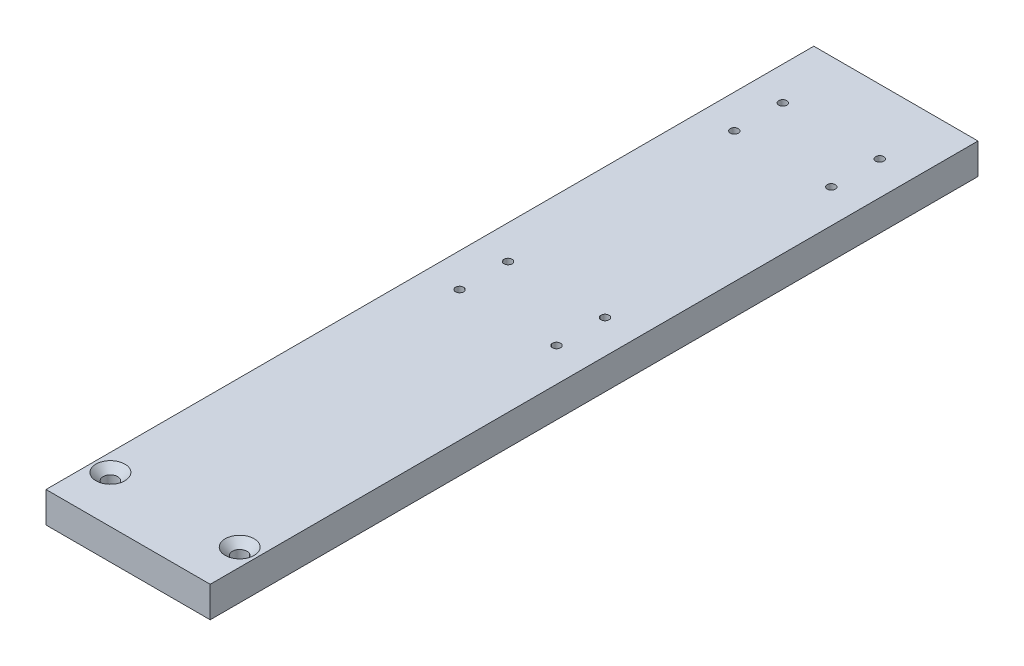
ISO-10303-21;
HEADER;
FILE_DESCRIPTION(('STEP AP214'),'2;1');
FILE_NAME('part.step','',(''),(''),'','','');
FILE_SCHEMA(('AUTOMOTIVE_DESIGN { 1 0 10303 214 1 1 1 1 }'));
ENDSEC;
DATA;
#1=APPLICATION_CONTEXT('core data for automotive mechanical design processes');
#2=APPLICATION_PROTOCOL_DEFINITION('international standard','automotive_design',2000,#1);
#3=PRODUCT_CONTEXT('',#1,'mechanical');
#4=PRODUCT('Part','Part','',(#3));
#5=PRODUCT_RELATED_PRODUCT_CATEGORY('part','',(#4));
#6=PRODUCT_DEFINITION_FORMATION('','',#4);
#7=PRODUCT_DEFINITION_CONTEXT('part definition',#1,'design');
#8=PRODUCT_DEFINITION('design','',#6,#7);
#9=PRODUCT_DEFINITION_SHAPE('','',#8);
#10=(LENGTH_UNIT() NAMED_UNIT(*) SI_UNIT(.MILLI.,.METRE.));
#11=(NAMED_UNIT(*) PLANE_ANGLE_UNIT() SI_UNIT($,.RADIAN.));
#12=(NAMED_UNIT(*) SI_UNIT($,.STERADIAN.) SOLID_ANGLE_UNIT());
#13=UNCERTAINTY_MEASURE_WITH_UNIT(LENGTH_MEASURE(1.E-05),#10,'distance_accuracy_value','');
#14=(GEOMETRIC_REPRESENTATION_CONTEXT(3) GLOBAL_UNCERTAINTY_ASSIGNED_CONTEXT((#13)) GLOBAL_UNIT_ASSIGNED_CONTEXT((#10,
#11,#12)) REPRESENTATION_CONTEXT('',''));
#15=CARTESIAN_POINT('',(0.,0.,0.));
#16=DIRECTION('',(0.,0.,1.));
#17=DIRECTION('',(1.,0.,0.));
#18=AXIS2_PLACEMENT_3D('',#15,#16,#17);
#19=CARTESIAN_POINT('',(-25.4,4.7625,118.775));
#20=DIRECTION('',(0.,-1.,0.));
#21=DIRECTION('',(0.,0.,-1.));
#22=AXIS2_PLACEMENT_3D('',#19,#20,#21);
#23=PLANE('',#22);
#24=CARTESIAN_POINT('',(-20.,4.7625,104.25));
#25=DIRECTION('',(0.,1.,0.));
#26=DIRECTION('',(0.,0.,1.));
#27=AXIS2_PLACEMENT_3D('',#24,#25,#26);
#28=CIRCLE('',#27,4.48);
#29=CARTESIAN_POINT('',(-20.,4.7625,108.73));
#30=VERTEX_POINT('',#29);
#31=EDGE_CURVE('E172',#30,#30,#28,.T.);
#32=ORIENTED_EDGE('',*,*,#31,.F.);
#33=EDGE_LOOP('',(#32));
#34=FACE_BOUND('',#33,.T.);
#35=CARTESIAN_POINT('',(20.,4.7625,104.25));
#36=DIRECTION('',(0.,1.,0.));
#37=DIRECTION('',(0.,0.,1.));
#38=AXIS2_PLACEMENT_3D('',#35,#36,#37);
#39=CIRCLE('',#38,4.48);
#40=CARTESIAN_POINT('',(20.,4.7625,108.73));
#41=VERTEX_POINT('',#40);
#42=EDGE_CURVE('E163',#41,#41,#39,.T.);
#43=ORIENTED_EDGE('',*,*,#42,.F.);
#44=EDGE_LOOP('',(#43));
#45=FACE_BOUND('',#44,.T.);
#46=CARTESIAN_POINT('',(-15.,4.7625,-98.775));
#47=DIRECTION('',(0.,1.,0.));
#48=DIRECTION('',(0.,0.,1.));
#49=AXIS2_PLACEMENT_3D('',#46,#47,#48);
#50=CIRCLE('',#49,1.25);
#51=CARTESIAN_POINT('',(-15.,4.7625,-97.525));
#52=VERTEX_POINT('',#51);
#53=EDGE_CURVE('E154',#52,#52,#50,.T.);
#54=ORIENTED_EDGE('',*,*,#53,.F.);
#55=EDGE_LOOP('',(#54));
#56=FACE_BOUND('',#55,.T.);
#57=CARTESIAN_POINT('',(15.,4.7625,-98.775));
#58=DIRECTION('',(0.,1.,0.));
#59=DIRECTION('',(0.,0.,1.));
#60=AXIS2_PLACEMENT_3D('',#57,#58,#59);
#61=CIRCLE('',#60,1.25);
#62=CARTESIAN_POINT('',(15.,4.7625,-97.525));
#63=VERTEX_POINT('',#62);
#64=EDGE_CURVE('E148',#63,#63,#61,.T.);
#65=ORIENTED_EDGE('',*,*,#64,.F.);
#66=EDGE_LOOP('',(#65));
#67=FACE_BOUND('',#66,.T.);
#68=CARTESIAN_POINT('',(-15.,4.7625,-83.775));
#69=DIRECTION('',(0.,1.,0.));
#70=DIRECTION('',(0.,0.,1.));
#71=AXIS2_PLACEMENT_3D('',#68,#69,#70);
#72=CIRCLE('',#71,1.25);
#73=CARTESIAN_POINT('',(-15.,4.7625,-82.525));
#74=VERTEX_POINT('',#73);
#75=EDGE_CURVE('E142',#74,#74,#72,.T.);
#76=ORIENTED_EDGE('',*,*,#75,.F.);
#77=EDGE_LOOP('',(#76));
#78=FACE_BOUND('',#77,.T.);
#79=CARTESIAN_POINT('',(15.,4.7625,-83.775));
#80=DIRECTION('',(0.,1.,0.));
#81=DIRECTION('',(0.,0.,1.));
#82=AXIS2_PLACEMENT_3D('',#79,#80,#81);
#83=CIRCLE('',#82,1.25);
#84=CARTESIAN_POINT('',(15.,4.7625,-82.525));
#85=VERTEX_POINT('',#84);
#86=EDGE_CURVE('E136',#85,#85,#83,.T.);
#87=ORIENTED_EDGE('',*,*,#86,.F.);
#88=EDGE_LOOP('',(#87));
#89=FACE_BOUND('',#88,.T.);
#90=CARTESIAN_POINT('',(15.,4.7625,-13.775));
#91=DIRECTION('',(0.,1.,0.));
#92=DIRECTION('',(0.,0.,1.));
#93=AXIS2_PLACEMENT_3D('',#90,#91,#92);
#94=CIRCLE('',#93,1.25);
#95=CARTESIAN_POINT('',(15.,4.7625,-12.525));
#96=VERTEX_POINT('',#95);
#97=EDGE_CURVE('E130',#96,#96,#94,.T.);
#98=ORIENTED_EDGE('',*,*,#97,.F.);
#99=EDGE_LOOP('',(#98));
#100=FACE_BOUND('',#99,.T.);
#101=CARTESIAN_POINT('',(-15.,4.7625,-13.775));
#102=DIRECTION('',(0.,1.,0.));
#103=DIRECTION('',(0.,0.,1.));
#104=AXIS2_PLACEMENT_3D('',#101,#102,#103);
#105=CIRCLE('',#104,1.25);
#106=CARTESIAN_POINT('',(-15.,4.7625,-12.525));
#107=VERTEX_POINT('',#106);
#108=EDGE_CURVE('E124',#107,#107,#105,.T.);
#109=ORIENTED_EDGE('',*,*,#108,.F.);
#110=EDGE_LOOP('',(#109));
#111=FACE_BOUND('',#110,.T.);
#112=CARTESIAN_POINT('',(-15.,4.7625,1.22499999999999));
#113=DIRECTION('',(0.,1.,0.));
#114=DIRECTION('',(0.,0.,1.));
#115=AXIS2_PLACEMENT_3D('',#112,#113,#114);
#116=CIRCLE('',#115,1.25);
#117=CARTESIAN_POINT('',(-15.,4.7625,2.47499999999999));
#118=VERTEX_POINT('',#117);
#119=EDGE_CURVE('E112',#118,#118,#116,.T.);
#120=ORIENTED_EDGE('',*,*,#119,.F.);
#121=EDGE_LOOP('',(#120));
#122=FACE_BOUND('',#121,.T.);
#123=DIRECTION('',(-1.,0.,0.));
#124=VECTOR('',#123,1.);
#125=CARTESIAN_POINT('',(-25.4,4.7625,-118.775));
#126=LINE('',#125,#124);
#127=CARTESIAN_POINT('',(25.4,4.7625,-118.775));
#128=VERTEX_POINT('',#127);
#129=CARTESIAN_POINT('',(-25.4,4.7625,-118.775));
#130=VERTEX_POINT('',#129);
#131=EDGE_CURVE('E88',#128,#130,#126,.T.);
#132=ORIENTED_EDGE('',*,*,#131,.T.);
#133=DIRECTION('',(0.,0.,-1.));
#134=VECTOR('',#133,1.);
#135=CARTESIAN_POINT('',(-25.4,4.7625,118.775));
#136=LINE('',#135,#134);
#137=CARTESIAN_POINT('',(-25.4,4.7625,118.775));
#138=VERTEX_POINT('',#137);
#139=EDGE_CURVE('E41',#138,#130,#136,.T.);
#140=ORIENTED_EDGE('',*,*,#139,.F.);
#141=DIRECTION('',(-1.,0.,0.));
#142=VECTOR('',#141,1.);
#143=CARTESIAN_POINT('',(-25.4,4.7625,118.775));
#144=LINE('',#143,#142);
#145=CARTESIAN_POINT('',(25.4,4.7625,118.775));
#146=VERTEX_POINT('',#145);
#147=EDGE_CURVE('E79',#146,#138,#144,.T.);
#148=ORIENTED_EDGE('',*,*,#147,.F.);
#149=DIRECTION('',(0.,0.,-1.));
#150=VECTOR('',#149,1.);
#151=CARTESIAN_POINT('',(25.4,4.7625,118.775));
#152=LINE('',#151,#150);
#153=EDGE_CURVE('E11',#146,#128,#152,.T.);
#154=ORIENTED_EDGE('',*,*,#153,.T.);
#155=EDGE_LOOP('',(#132,#140,#148,#154));
#156=FACE_BOUND('',#155,.T.);
#157=CARTESIAN_POINT('',(15.,4.7625,1.22499999999999));
#158=DIRECTION('',(0.,1.,0.));
#159=DIRECTION('',(0.,0.,1.));
#160=AXIS2_PLACEMENT_3D('',#157,#158,#159);
#161=CIRCLE('',#160,1.25);
#162=CARTESIAN_POINT('',(15.,4.7625,2.47499999999999));
#163=VERTEX_POINT('',#162);
#164=EDGE_CURVE('E118',#163,#163,#161,.T.);
#165=ORIENTED_EDGE('',*,*,#164,.F.);
#166=EDGE_LOOP('',(#165));
#167=FACE_BOUND('',#166,.T.);
#168=ADVANCED_FACE('F32',(#34,#45,#56,#67,#78,#89,#100,#111,#122,#156,#167),#23,.F.);
#169=CARTESIAN_POINT('',(25.4,-4.7625,118.775));
#170=DIRECTION('',(-1.,0.,0.));
#171=DIRECTION('',(0.,0.,1.));
#172=AXIS2_PLACEMENT_3D('',#169,#170,#171);
#173=PLANE('',#172);
#174=DIRECTION('',(0.,1.,0.));
#175=VECTOR('',#174,1.);
#176=CARTESIAN_POINT('',(25.4,-4.7625,-118.775));
#177=LINE('',#176,#175);
#178=CARTESIAN_POINT('',(25.4,-4.7625,-118.775));
#179=VERTEX_POINT('',#178);
#180=EDGE_CURVE('E96',#179,#128,#177,.T.);
#181=ORIENTED_EDGE('',*,*,#180,.T.);
#182=ORIENTED_EDGE('',*,*,#153,.F.);
#183=DIRECTION('',(0.,1.,0.));
#184=VECTOR('',#183,1.);
#185=CARTESIAN_POINT('',(25.4,-4.7625,118.775));
#186=LINE('',#185,#184);
#187=CARTESIAN_POINT('',(25.4,-4.7625,118.775));
#188=VERTEX_POINT('',#187);
#189=EDGE_CURVE('E84',#188,#146,#186,.T.);
#190=ORIENTED_EDGE('',*,*,#189,.F.);
#191=DIRECTION('',(0.,0.,-1.));
#192=VECTOR('',#191,1.);
#193=CARTESIAN_POINT('',(25.4,-4.7625,118.775));
#194=LINE('',#193,#192);
#195=EDGE_CURVE('E92',#188,#179,#194,.T.);
#196=ORIENTED_EDGE('',*,*,#195,.T.);
#197=EDGE_LOOP('',(#181,#182,#190,#196));
#198=FACE_BOUND('',#197,.T.);
#199=ADVANCED_FACE('F34',(#198),#173,.F.);
#200=CARTESIAN_POINT('',(-25.4,-4.7625,118.775));
#201=DIRECTION('',(1.,0.,0.));
#202=DIRECTION('',(0.,0.,-1.));
#203=AXIS2_PLACEMENT_3D('',#200,#201,#202);
#204=PLANE('',#203);
#205=DIRECTION('',(0.,-1.,0.));
#206=VECTOR('',#205,1.);
#207=CARTESIAN_POINT('',(-25.4,-4.7625,-118.775));
#208=LINE('',#207,#206);
#209=CARTESIAN_POINT('',(-25.4,-4.7625,-118.775));
#210=VERTEX_POINT('',#209);
#211=EDGE_CURVE('E66',#130,#210,#208,.T.);
#212=ORIENTED_EDGE('',*,*,#211,.T.);
#213=DIRECTION('',(0.,0.,-1.));
#214=VECTOR('',#213,1.);
#215=CARTESIAN_POINT('',(-25.4,-4.7625,118.775));
#216=LINE('',#215,#214);
#217=CARTESIAN_POINT('',(-25.4,-4.7625,118.775));
#218=VERTEX_POINT('',#217);
#219=EDGE_CURVE('E89',#218,#210,#216,.T.);
#220=ORIENTED_EDGE('',*,*,#219,.F.);
#221=DIRECTION('',(0.,-1.,0.));
#222=VECTOR('',#221,1.);
#223=CARTESIAN_POINT('',(-25.4,-4.7625,118.775));
#224=LINE('',#223,#222);
#225=EDGE_CURVE('E82',#138,#218,#224,.T.);
#226=ORIENTED_EDGE('',*,*,#225,.F.);
#227=ORIENTED_EDGE('',*,*,#139,.T.);
#228=EDGE_LOOP('',(#212,#220,#226,#227));
#229=FACE_BOUND('',#228,.T.);
#230=ADVANCED_FACE('F90',(#229),#204,.F.);
#231=CARTESIAN_POINT('',(-25.4,-4.7625,118.775));
#232=DIRECTION('',(0.,1.,0.));
#233=DIRECTION('',(0.,0.,1.));
#234=AXIS2_PLACEMENT_3D('',#231,#232,#233);
#235=PLANE('',#234);
#236=CARTESIAN_POINT('',(-20.,-4.7625,104.25));
#237=DIRECTION('',(0.,1.,0.));
#238=DIRECTION('',(0.,0.,1.));
#239=AXIS2_PLACEMENT_3D('',#236,#237,#238);
#240=CIRCLE('',#239,2.25);
#241=CARTESIAN_POINT('',(-20.,-4.7625,106.5));
#242=VERTEX_POINT('',#241);
#243=EDGE_CURVE('E166',#242,#242,#240,.T.);
#244=ORIENTED_EDGE('',*,*,#243,.T.);
#245=EDGE_LOOP('',(#244));
#246=FACE_BOUND('',#245,.T.);
#247=CARTESIAN_POINT('',(20.,-4.7625,104.25));
#248=DIRECTION('',(0.,1.,0.));
#249=DIRECTION('',(0.,0.,1.));
#250=AXIS2_PLACEMENT_3D('',#247,#248,#249);
#251=CIRCLE('',#250,2.25);
#252=CARTESIAN_POINT('',(20.,-4.7625,106.5));
#253=VERTEX_POINT('',#252);
#254=EDGE_CURVE('E157',#253,#253,#251,.T.);
#255=ORIENTED_EDGE('',*,*,#254,.T.);
#256=EDGE_LOOP('',(#255));
#257=FACE_BOUND('',#256,.T.);
#258=CARTESIAN_POINT('',(-15.,-4.7625,-98.775));
#259=DIRECTION('',(0.,1.,0.));
#260=DIRECTION('',(0.,0.,1.));
#261=AXIS2_PLACEMENT_3D('',#258,#259,#260);
#262=CIRCLE('',#261,1.25);
#263=CARTESIAN_POINT('',(-15.,-4.7625,-97.525));
#264=VERTEX_POINT('',#263);
#265=EDGE_CURVE('E151',#264,#264,#262,.T.);
#266=ORIENTED_EDGE('',*,*,#265,.T.);
#267=EDGE_LOOP('',(#266));
#268=FACE_BOUND('',#267,.T.);
#269=CARTESIAN_POINT('',(15.,-4.7625,-98.775));
#270=DIRECTION('',(0.,1.,0.));
#271=DIRECTION('',(0.,0.,1.));
#272=AXIS2_PLACEMENT_3D('',#269,#270,#271);
#273=CIRCLE('',#272,1.25);
#274=CARTESIAN_POINT('',(15.,-4.7625,-97.525));
#275=VERTEX_POINT('',#274);
#276=EDGE_CURVE('E145',#275,#275,#273,.T.);
#277=ORIENTED_EDGE('',*,*,#276,.T.);
#278=EDGE_LOOP('',(#277));
#279=FACE_BOUND('',#278,.T.);
#280=CARTESIAN_POINT('',(-15.,-4.7625,-83.775));
#281=DIRECTION('',(0.,1.,0.));
#282=DIRECTION('',(0.,0.,1.));
#283=AXIS2_PLACEMENT_3D('',#280,#281,#282);
#284=CIRCLE('',#283,1.25);
#285=CARTESIAN_POINT('',(-15.,-4.7625,-82.525));
#286=VERTEX_POINT('',#285);
#287=EDGE_CURVE('E139',#286,#286,#284,.T.);
#288=ORIENTED_EDGE('',*,*,#287,.T.);
#289=EDGE_LOOP('',(#288));
#290=FACE_BOUND('',#289,.T.);
#291=CARTESIAN_POINT('',(15.,-4.7625,-83.775));
#292=DIRECTION('',(0.,1.,0.));
#293=DIRECTION('',(0.,0.,1.));
#294=AXIS2_PLACEMENT_3D('',#291,#292,#293);
#295=CIRCLE('',#294,1.25);
#296=CARTESIAN_POINT('',(15.,-4.7625,-82.525));
#297=VERTEX_POINT('',#296);
#298=EDGE_CURVE('E133',#297,#297,#295,.T.);
#299=ORIENTED_EDGE('',*,*,#298,.T.);
#300=EDGE_LOOP('',(#299));
#301=FACE_BOUND('',#300,.T.);
#302=CARTESIAN_POINT('',(15.,-4.7625,-13.775));
#303=DIRECTION('',(0.,1.,0.));
#304=DIRECTION('',(0.,0.,1.));
#305=AXIS2_PLACEMENT_3D('',#302,#303,#304);
#306=CIRCLE('',#305,1.25);
#307=CARTESIAN_POINT('',(15.,-4.7625,-12.525));
#308=VERTEX_POINT('',#307);
#309=EDGE_CURVE('E127',#308,#308,#306,.T.);
#310=ORIENTED_EDGE('',*,*,#309,.T.);
#311=EDGE_LOOP('',(#310));
#312=FACE_BOUND('',#311,.T.);
#313=CARTESIAN_POINT('',(-15.,-4.7625,-13.775));
#314=DIRECTION('',(0.,1.,0.));
#315=DIRECTION('',(0.,0.,1.));
#316=AXIS2_PLACEMENT_3D('',#313,#314,#315);
#317=CIRCLE('',#316,1.25);
#318=CARTESIAN_POINT('',(-15.,-4.7625,-12.525));
#319=VERTEX_POINT('',#318);
#320=EDGE_CURVE('E121',#319,#319,#317,.T.);
#321=ORIENTED_EDGE('',*,*,#320,.T.);
#322=EDGE_LOOP('',(#321));
#323=FACE_BOUND('',#322,.T.);
#324=CARTESIAN_POINT('',(15.,-4.7625,1.22499999999999));
#325=DIRECTION('',(0.,1.,0.));
#326=DIRECTION('',(0.,0.,1.));
#327=AXIS2_PLACEMENT_3D('',#324,#325,#326);
#328=CIRCLE('',#327,1.25);
#329=CARTESIAN_POINT('',(15.,-4.7625,2.47499999999999));
#330=VERTEX_POINT('',#329);
#331=EDGE_CURVE('E115',#330,#330,#328,.T.);
#332=ORIENTED_EDGE('',*,*,#331,.T.);
#333=EDGE_LOOP('',(#332));
#334=FACE_BOUND('',#333,.T.);
#335=CARTESIAN_POINT('',(-15.,-4.7625,1.22499999999999));
#336=DIRECTION('',(0.,1.,0.));
#337=DIRECTION('',(0.,0.,1.));
#338=AXIS2_PLACEMENT_3D('',#335,#336,#337);
#339=CIRCLE('',#338,1.25);
#340=CARTESIAN_POINT('',(-15.,-4.7625,2.47499999999999));
#341=VERTEX_POINT('',#340);
#342=EDGE_CURVE('E99',#341,#341,#339,.T.);
#343=ORIENTED_EDGE('',*,*,#342,.T.);
#344=EDGE_LOOP('',(#343));
#345=FACE_BOUND('',#344,.T.);
#346=DIRECTION('',(1.,0.,0.));
#347=VECTOR('',#346,1.);
#348=CARTESIAN_POINT('',(-25.4,-4.7625,-118.775));
#349=LINE('',#348,#347);
#350=EDGE_CURVE('E72',#210,#179,#349,.T.);
#351=ORIENTED_EDGE('',*,*,#350,.T.);
#352=ORIENTED_EDGE('',*,*,#195,.F.);
#353=DIRECTION('',(1.,0.,0.));
#354=VECTOR('',#353,1.);
#355=CARTESIAN_POINT('',(-25.4,-4.7625,118.775));
#356=LINE('',#355,#354);
#357=EDGE_CURVE('E49',#218,#188,#356,.T.);
#358=ORIENTED_EDGE('',*,*,#357,.F.);
#359=ORIENTED_EDGE('',*,*,#219,.T.);
#360=EDGE_LOOP('',(#351,#352,#358,#359));
#361=FACE_BOUND('',#360,.T.);
#362=ADVANCED_FACE('F104',(#246,#257,#268,#279,#290,#301,#312,#323,#334,#345,#361),#235,.F.);
#363=CARTESIAN_POINT('',(0.,0.,118.775));
#364=DIRECTION('',(0.,0.,-1.));
#365=DIRECTION('',(-1.,0.,0.));
#366=AXIS2_PLACEMENT_3D('',#363,#364,#365);
#367=PLANE('',#366);
#368=ORIENTED_EDGE('',*,*,#189,.T.);
#369=ORIENTED_EDGE('',*,*,#147,.T.);
#370=ORIENTED_EDGE('',*,*,#225,.T.);
#371=ORIENTED_EDGE('',*,*,#357,.T.);
#372=EDGE_LOOP('',(#368,#369,#370,#371));
#373=FACE_BOUND('',#372,.T.);
#374=ADVANCED_FACE('F80',(#373),#367,.F.);
#375=CARTESIAN_POINT('',(0.,0.,-118.775));
#376=DIRECTION('',(0.,0.,-1.));
#377=DIRECTION('',(-1.,0.,0.));
#378=AXIS2_PLACEMENT_3D('',#375,#376,#377);
#379=PLANE('',#378);
#380=ORIENTED_EDGE('',*,*,#180,.F.);
#381=ORIENTED_EDGE('',*,*,#350,.F.);
#382=ORIENTED_EDGE('',*,*,#211,.F.);
#383=ORIENTED_EDGE('',*,*,#131,.F.);
#384=EDGE_LOOP('',(#380,#381,#382,#383));
#385=FACE_BOUND('',#384,.T.);
#386=ADVANCED_FACE('F107',(#385),#379,.T.);
#387=CARTESIAN_POINT('',(-15.,4.7625,1.22499999999999));
#388=DIRECTION('',(0.,1.,0.));
#389=DIRECTION('',(0.,0.,1.));
#390=AXIS2_PLACEMENT_3D('',#387,#388,#389);
#391=CYLINDRICAL_SURFACE('',#390,1.25);
#392=ORIENTED_EDGE('',*,*,#342,.F.);
#393=EDGE_LOOP('',(#392));
#394=FACE_BOUND('',#393,.T.);
#395=ORIENTED_EDGE('',*,*,#119,.T.);
#396=EDGE_LOOP('',(#395));
#397=FACE_BOUND('',#396,.T.);
#398=ADVANCED_FACE('F196',(#394,#397),#391,.F.);
#399=CARTESIAN_POINT('',(15.,4.7625,1.22499999999999));
#400=DIRECTION('',(0.,1.,0.));
#401=DIRECTION('',(0.,0.,1.));
#402=AXIS2_PLACEMENT_3D('',#399,#400,#401);
#403=CYLINDRICAL_SURFACE('',#402,1.25);
#404=ORIENTED_EDGE('',*,*,#331,.F.);
#405=EDGE_LOOP('',(#404));
#406=FACE_BOUND('',#405,.T.);
#407=ORIENTED_EDGE('',*,*,#164,.T.);
#408=EDGE_LOOP('',(#407));
#409=FACE_BOUND('',#408,.T.);
#410=ADVANCED_FACE('F198',(#406,#409),#403,.F.);
#411=CARTESIAN_POINT('',(-15.,4.7625,-13.775));
#412=DIRECTION('',(0.,1.,0.));
#413=DIRECTION('',(0.,0.,1.));
#414=AXIS2_PLACEMENT_3D('',#411,#412,#413);
#415=CYLINDRICAL_SURFACE('',#414,1.25);
#416=ORIENTED_EDGE('',*,*,#320,.F.);
#417=EDGE_LOOP('',(#416));
#418=FACE_BOUND('',#417,.T.);
#419=ORIENTED_EDGE('',*,*,#108,.T.);
#420=EDGE_LOOP('',(#419));
#421=FACE_BOUND('',#420,.T.);
#422=ADVANCED_FACE('F205',(#418,#421),#415,.F.);
#423=CARTESIAN_POINT('',(15.,4.7625,-13.775));
#424=DIRECTION('',(0.,1.,0.));
#425=DIRECTION('',(0.,0.,1.));
#426=AXIS2_PLACEMENT_3D('',#423,#424,#425);
#427=CYLINDRICAL_SURFACE('',#426,1.25);
#428=ORIENTED_EDGE('',*,*,#309,.F.);
#429=EDGE_LOOP('',(#428));
#430=FACE_BOUND('',#429,.T.);
#431=ORIENTED_EDGE('',*,*,#97,.T.);
#432=EDGE_LOOP('',(#431));
#433=FACE_BOUND('',#432,.T.);
#434=ADVANCED_FACE('F301',(#430,#433),#427,.F.);
#435=CARTESIAN_POINT('',(15.,4.7625,-83.775));
#436=DIRECTION('',(0.,1.,0.));
#437=DIRECTION('',(0.,0.,1.));
#438=AXIS2_PLACEMENT_3D('',#435,#436,#437);
#439=CYLINDRICAL_SURFACE('',#438,1.25);
#440=ORIENTED_EDGE('',*,*,#298,.F.);
#441=EDGE_LOOP('',(#440));
#442=FACE_BOUND('',#441,.T.);
#443=ORIENTED_EDGE('',*,*,#86,.T.);
#444=EDGE_LOOP('',(#443));
#445=FACE_BOUND('',#444,.T.);
#446=ADVANCED_FACE('F297',(#442,#445),#439,.F.);
#447=CARTESIAN_POINT('',(-15.,4.7625,-83.775));
#448=DIRECTION('',(0.,1.,0.));
#449=DIRECTION('',(0.,0.,1.));
#450=AXIS2_PLACEMENT_3D('',#447,#448,#449);
#451=CYLINDRICAL_SURFACE('',#450,1.25);
#452=ORIENTED_EDGE('',*,*,#287,.F.);
#453=EDGE_LOOP('',(#452));
#454=FACE_BOUND('',#453,.T.);
#455=ORIENTED_EDGE('',*,*,#75,.T.);
#456=EDGE_LOOP('',(#455));
#457=FACE_BOUND('',#456,.T.);
#458=ADVANCED_FACE('F293',(#454,#457),#451,.F.);
#459=CARTESIAN_POINT('',(15.,4.7625,-98.775));
#460=DIRECTION('',(0.,1.,0.));
#461=DIRECTION('',(0.,0.,1.));
#462=AXIS2_PLACEMENT_3D('',#459,#460,#461);
#463=CYLINDRICAL_SURFACE('',#462,1.25);
#464=ORIENTED_EDGE('',*,*,#276,.F.);
#465=EDGE_LOOP('',(#464));
#466=FACE_BOUND('',#465,.T.);
#467=ORIENTED_EDGE('',*,*,#64,.T.);
#468=EDGE_LOOP('',(#467));
#469=FACE_BOUND('',#468,.T.);
#470=ADVANCED_FACE('F289',(#466,#469),#463,.F.);
#471=CARTESIAN_POINT('',(-15.,4.7625,-98.775));
#472=DIRECTION('',(0.,1.,0.));
#473=DIRECTION('',(0.,0.,1.));
#474=AXIS2_PLACEMENT_3D('',#471,#472,#473);
#475=CYLINDRICAL_SURFACE('',#474,1.25);
#476=ORIENTED_EDGE('',*,*,#265,.F.);
#477=EDGE_LOOP('',(#476));
#478=FACE_BOUND('',#477,.T.);
#479=ORIENTED_EDGE('',*,*,#53,.T.);
#480=EDGE_LOOP('',(#479));
#481=FACE_BOUND('',#480,.T.);
#482=ADVANCED_FACE('F235',(#478,#481),#475,.F.);
#483=CARTESIAN_POINT('',(20.,4.7625,104.25));
#484=DIRECTION('',(0.,1.,0.));
#485=DIRECTION('',(0.,0.,1.));
#486=AXIS2_PLACEMENT_3D('',#483,#484,#485);
#487=CYLINDRICAL_SURFACE('',#486,2.25);
#488=ORIENTED_EDGE('',*,*,#254,.F.);
#489=EDGE_LOOP('',(#488));
#490=FACE_BOUND('',#489,.T.);
#491=CARTESIAN_POINT('',(20.,2.5325,104.25));
#492=DIRECTION('',(0.,1.,0.));
#493=DIRECTION('',(0.,0.,1.));
#494=AXIS2_PLACEMENT_3D('',#491,#492,#493);
#495=CIRCLE('',#494,2.25);
#496=CARTESIAN_POINT('',(20.,2.5325,106.5));
#497=VERTEX_POINT('',#496);
#498=EDGE_CURVE('E160',#497,#497,#495,.T.);
#499=ORIENTED_EDGE('',*,*,#498,.T.);
#500=EDGE_LOOP('',(#499));
#501=FACE_BOUND('',#500,.T.);
#502=ADVANCED_FACE('F248',(#490,#501),#487,.F.);
#503=CARTESIAN_POINT('',(20.,4.7625,104.25));
#504=DIRECTION('',(0.,1.,0.));
#505=DIRECTION('',(0.,0.,1.));
#506=AXIS2_PLACEMENT_3D('',#503,#504,#505);
#507=CONICAL_SURFACE('',#506,4.48,0.785398163397449);
#508=ORIENTED_EDGE('',*,*,#498,.F.);
#509=EDGE_LOOP('',(#508));
#510=FACE_BOUND('',#509,.T.);
#511=ORIENTED_EDGE('',*,*,#42,.T.);
#512=EDGE_LOOP('',(#511));
#513=FACE_BOUND('',#512,.T.);
#514=ADVANCED_FACE('F253',(#510,#513),#507,.F.);
#515=CARTESIAN_POINT('',(-20.,4.7625,104.25));
#516=DIRECTION('',(0.,1.,0.));
#517=DIRECTION('',(0.,0.,1.));
#518=AXIS2_PLACEMENT_3D('',#515,#516,#517);
#519=CYLINDRICAL_SURFACE('',#518,2.25);
#520=ORIENTED_EDGE('',*,*,#243,.F.);
#521=EDGE_LOOP('',(#520));
#522=FACE_BOUND('',#521,.T.);
#523=CARTESIAN_POINT('',(-20.,2.5325,104.25));
#524=DIRECTION('',(0.,1.,0.));
#525=DIRECTION('',(0.,0.,1.));
#526=AXIS2_PLACEMENT_3D('',#523,#524,#525);
#527=CIRCLE('',#526,2.25);
#528=CARTESIAN_POINT('',(-20.,2.5325,106.5));
#529=VERTEX_POINT('',#528);
#530=EDGE_CURVE('E169',#529,#529,#527,.T.);
#531=ORIENTED_EDGE('',*,*,#530,.T.);
#532=EDGE_LOOP('',(#531));
#533=FACE_BOUND('',#532,.T.);
#534=ADVANCED_FACE('F263',(#522,#533),#519,.F.);
#535=CARTESIAN_POINT('',(-20.,4.7625,104.25));
#536=DIRECTION('',(0.,1.,0.));
#537=DIRECTION('',(0.,0.,1.));
#538=AXIS2_PLACEMENT_3D('',#535,#536,#537);
#539=CONICAL_SURFACE('',#538,4.48,0.785398163397449);
#540=ORIENTED_EDGE('',*,*,#530,.F.);
#541=EDGE_LOOP('',(#540));
#542=FACE_BOUND('',#541,.T.);
#543=ORIENTED_EDGE('',*,*,#31,.T.);
#544=EDGE_LOOP('',(#543));
#545=FACE_BOUND('',#544,.T.);
#546=ADVANCED_FACE('F176',(#542,#545),#539,.F.);
#547=CLOSED_SHELL('',(#168,#199,#230,#362,#374,#386,#398,#410,#422,#434,#446,#458,#470,#482,
#502,#514,#534,#546));
#548=MANIFOLD_SOLID_BREP('B2',#547);
#549=ADVANCED_BREP_SHAPE_REPRESENTATION('',(#18,#548),#14);
#550=SHAPE_DEFINITION_REPRESENTATION(#9,#549);
ENDSEC;
END-ISO-10303-21;
